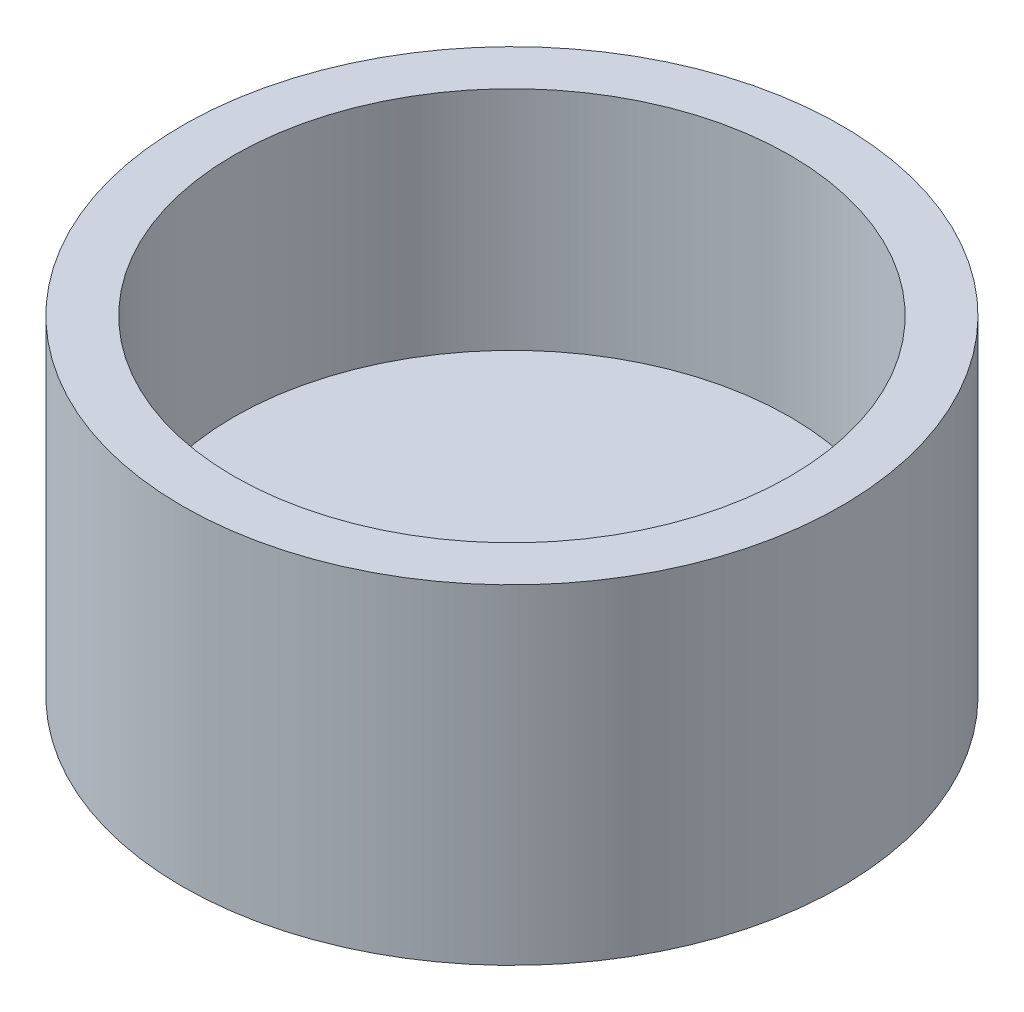
ISO-10303-21;
HEADER;
FILE_DESCRIPTION(('STEP AP214'),'2;1');
FILE_NAME('part.step','',(''),(''),'','','');
FILE_SCHEMA(('AUTOMOTIVE_DESIGN { 1 0 10303 214 1 1 1 1 }'));
ENDSEC;
DATA;
#1=APPLICATION_CONTEXT('core data for automotive mechanical design processes');
#2=APPLICATION_PROTOCOL_DEFINITION('international standard','automotive_design',2000,#1);
#3=PRODUCT_CONTEXT('',#1,'mechanical');
#4=PRODUCT('Part','Part','',(#3));
#5=PRODUCT_RELATED_PRODUCT_CATEGORY('part','',(#4));
#6=PRODUCT_DEFINITION_FORMATION('','',#4);
#7=PRODUCT_DEFINITION_CONTEXT('part definition',#1,'design');
#8=PRODUCT_DEFINITION('design','',#6,#7);
#9=PRODUCT_DEFINITION_SHAPE('','',#8);
#10=(LENGTH_UNIT() NAMED_UNIT(*) SI_UNIT(.MILLI.,.METRE.));
#11=(NAMED_UNIT(*) PLANE_ANGLE_UNIT() SI_UNIT($,.RADIAN.));
#12=(NAMED_UNIT(*) SI_UNIT($,.STERADIAN.) SOLID_ANGLE_UNIT());
#13=UNCERTAINTY_MEASURE_WITH_UNIT(LENGTH_MEASURE(1.E-05),#10,'distance_accuracy_value','');
#14=(GEOMETRIC_REPRESENTATION_CONTEXT(3) GLOBAL_UNCERTAINTY_ASSIGNED_CONTEXT((#13)) GLOBAL_UNIT_ASSIGNED_CONTEXT((#10,
#11,#12)) REPRESENTATION_CONTEXT('',''));
#15=CARTESIAN_POINT('',(0.,0.,0.));
#16=DIRECTION('',(0.,0.,1.));
#17=DIRECTION('',(1.,0.,0.));
#18=AXIS2_PLACEMENT_3D('',#15,#16,#17);
#19=CARTESIAN_POINT('',(0.,16.,0.));
#20=DIRECTION('',(0.,-1.,0.));
#21=DIRECTION('',(0.,0.,-1.));
#22=AXIS2_PLACEMENT_3D('',#19,#20,#21);
#23=CYLINDRICAL_SURFACE('',#22,16.);
#24=CARTESIAN_POINT('',(0.,16.,0.));
#25=DIRECTION('',(0.,1.,0.));
#26=DIRECTION('',(0.,0.,1.));
#27=AXIS2_PLACEMENT_3D('',#24,#25,#26);
#28=CIRCLE('',#27,16.);
#29=CARTESIAN_POINT('',(0.,16.,16.));
#30=VERTEX_POINT('',#29);
#31=EDGE_CURVE('E11',#30,#30,#28,.T.);
#32=ORIENTED_EDGE('',*,*,#31,.F.);
#33=EDGE_LOOP('',(#32));
#34=FACE_BOUND('',#33,.T.);
#35=CARTESIAN_POINT('',(0.,0.,0.));
#36=DIRECTION('',(0.,1.,0.));
#37=DIRECTION('',(0.,0.,1.));
#38=AXIS2_PLACEMENT_3D('',#35,#36,#37);
#39=CIRCLE('',#38,16.);
#40=CARTESIAN_POINT('',(0.,0.,16.));
#41=VERTEX_POINT('',#40);
#42=EDGE_CURVE('E42',#41,#41,#39,.T.);
#43=ORIENTED_EDGE('',*,*,#42,.T.);
#44=EDGE_LOOP('',(#43));
#45=FACE_BOUND('',#44,.T.);
#46=ADVANCED_FACE('F39',(#34,#45),#23,.T.);
#47=CARTESIAN_POINT('',(0.,16.,0.));
#48=DIRECTION('',(0.,1.,0.));
#49=DIRECTION('',(0.,0.,1.));
#50=AXIS2_PLACEMENT_3D('',#47,#48,#49);
#51=PLANE('',#50);
#52=CARTESIAN_POINT('',(0.,16.,0.));
#53=DIRECTION('',(0.,1.,0.));
#54=DIRECTION('',(0.,0.,1.));
#55=AXIS2_PLACEMENT_3D('',#52,#53,#54);
#56=CIRCLE('',#55,13.5);
#57=CARTESIAN_POINT('',(0.,16.,13.5));
#58=VERTEX_POINT('',#57);
#59=EDGE_CURVE('E56',#58,#58,#56,.T.);
#60=ORIENTED_EDGE('',*,*,#59,.F.);
#61=EDGE_LOOP('',(#60));
#62=FACE_BOUND('',#61,.T.);
#63=ORIENTED_EDGE('',*,*,#31,.T.);
#64=EDGE_LOOP('',(#63));
#65=FACE_BOUND('',#64,.T.);
#66=ADVANCED_FACE('F63',(#62,#65),#51,.T.);
#67=CARTESIAN_POINT('',(0.,0.,0.));
#68=DIRECTION('',(0.,1.,0.));
#69=DIRECTION('',(0.,0.,1.));
#70=AXIS2_PLACEMENT_3D('',#67,#68,#69);
#71=PLANE('',#70);
#72=ORIENTED_EDGE('',*,*,#42,.F.);
#73=EDGE_LOOP('',(#72));
#74=FACE_BOUND('',#73,.T.);
#75=ADVANCED_FACE('F65',(#74),#71,.F.);
#76=CARTESIAN_POINT('',(0.,-38.1837661840736,0.));
#77=DIRECTION('',(0.,1.,0.));
#78=DIRECTION('',(0.,0.,1.));
#79=AXIS2_PLACEMENT_3D('',#76,#77,#78);
#80=CYLINDRICAL_SURFACE('',#79,13.5);
#81=CARTESIAN_POINT('',(0.,5.,0.));
#82=DIRECTION('',(0.,1.,0.));
#83=DIRECTION('',(0.,0.,1.));
#84=AXIS2_PLACEMENT_3D('',#81,#82,#83);
#85=CIRCLE('',#84,13.5);
#86=CARTESIAN_POINT('',(0.,5.,13.5));
#87=VERTEX_POINT('',#86);
#88=EDGE_CURVE('E51',#87,#87,#85,.F.);
#89=ORIENTED_EDGE('',*,*,#88,.T.);
#90=EDGE_LOOP('',(#89));
#91=FACE_BOUND('',#90,.T.);
#92=ORIENTED_EDGE('',*,*,#59,.T.);
#93=EDGE_LOOP('',(#92));
#94=FACE_BOUND('',#93,.T.);
#95=ADVANCED_FACE('F61',(#91,#94),#80,.F.);
#96=CARTESIAN_POINT('',(0.,5.,0.));
#97=DIRECTION('',(0.,1.,0.));
#98=DIRECTION('',(0.,0.,1.));
#99=AXIS2_PLACEMENT_3D('',#96,#97,#98);
#100=PLANE('',#99);
#101=ORIENTED_EDGE('',*,*,#88,.F.);
#102=EDGE_LOOP('',(#101));
#103=FACE_BOUND('',#102,.T.);
#104=ADVANCED_FACE('F76',(#103),#100,.T.);
#105=CLOSED_SHELL('',(#46,#66,#75,#95,#104));
#106=MANIFOLD_SOLID_BREP('B2',#105);
#107=ADVANCED_BREP_SHAPE_REPRESENTATION('',(#18,#106),#14);
#108=SHAPE_DEFINITION_REPRESENTATION(#9,#107);
ENDSEC;
END-ISO-10303-21;
